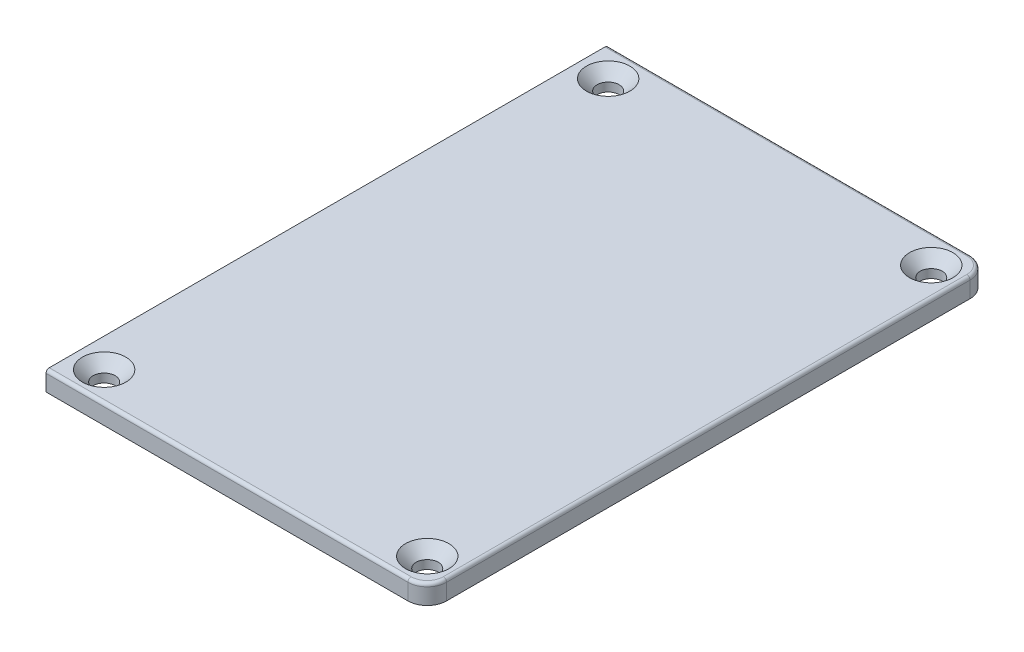
ISO-10303-21;
HEADER;
FILE_DESCRIPTION(('STEP AP214'),'2;1');
FILE_NAME('part.step','',(''),(''),'','','');
FILE_SCHEMA(('AUTOMOTIVE_DESIGN { 1 0 10303 214 1 1 1 1 }'));
ENDSEC;
DATA;
#1=APPLICATION_CONTEXT('core data for automotive mechanical design processes');
#2=APPLICATION_PROTOCOL_DEFINITION('international standard','automotive_design',2000,#1);
#3=PRODUCT_CONTEXT('',#1,'mechanical');
#4=PRODUCT('Part','Part','',(#3));
#5=PRODUCT_RELATED_PRODUCT_CATEGORY('part','',(#4));
#6=PRODUCT_DEFINITION_FORMATION('','',#4);
#7=PRODUCT_DEFINITION_CONTEXT('part definition',#1,'design');
#8=PRODUCT_DEFINITION('design','',#6,#7);
#9=PRODUCT_DEFINITION_SHAPE('','',#8);
#10=(LENGTH_UNIT() NAMED_UNIT(*) SI_UNIT(.MILLI.,.METRE.));
#11=(NAMED_UNIT(*) PLANE_ANGLE_UNIT() SI_UNIT($,.RADIAN.));
#12=(NAMED_UNIT(*) SI_UNIT($,.STERADIAN.) SOLID_ANGLE_UNIT());
#13=UNCERTAINTY_MEASURE_WITH_UNIT(LENGTH_MEASURE(1.E-05),#10,'distance_accuracy_value','');
#14=(GEOMETRIC_REPRESENTATION_CONTEXT(3) GLOBAL_UNCERTAINTY_ASSIGNED_CONTEXT((#13)) GLOBAL_UNIT_ASSIGNED_CONTEXT((#10,
#11,#12)) REPRESENTATION_CONTEXT('',''));
#15=CARTESIAN_POINT('',(0.,0.,0.));
#16=DIRECTION('',(0.,0.,1.));
#17=DIRECTION('',(1.,0.,0.));
#18=AXIS2_PLACEMENT_3D('',#15,#16,#17);
#19=CARTESIAN_POINT('',(29.5,1.5,43.5));
#20=DIRECTION('',(-1.,0.,0.));
#21=DIRECTION('',(0.,0.,1.));
#22=AXIS2_PLACEMENT_3D('',#19,#20,#21);
#23=PLANE('',#22);
#24=DIRECTION('',(0.,-1.,0.));
#25=VECTOR('',#24,1.);
#26=CARTESIAN_POINT('',(29.5,1.5,-40.5));
#27=LINE('',#26,#25);
#28=CARTESIAN_POINT('',(29.5,-1.5,-40.5));
#29=VERTEX_POINT('',#28);
#30=CARTESIAN_POINT('',(29.5,1.,-40.5));
#31=VERTEX_POINT('',#30);
#32=EDGE_CURVE('E157',#29,#31,#27,.F.);
#33=ORIENTED_EDGE('',*,*,#32,.T.);
#34=DIRECTION('',(0.,0.,-1.));
#35=VECTOR('',#34,1.);
#36=CARTESIAN_POINT('',(29.5,1.,43.5));
#37=LINE('',#36,#35);
#38=CARTESIAN_POINT('',(29.5,1.,40.5));
#39=VERTEX_POINT('',#38);
#40=EDGE_CURVE('E11',#31,#39,#37,.F.);
#41=ORIENTED_EDGE('',*,*,#40,.T.);
#42=DIRECTION('',(0.,-1.,0.));
#43=VECTOR('',#42,1.);
#44=CARTESIAN_POINT('',(29.5,1.5,40.5));
#45=LINE('',#44,#43);
#46=CARTESIAN_POINT('',(29.5,-1.5,40.5));
#47=VERTEX_POINT('',#46);
#48=EDGE_CURVE('E154',#39,#47,#45,.T.);
#49=ORIENTED_EDGE('',*,*,#48,.T.);
#50=DIRECTION('',(0.,0.,-1.));
#51=VECTOR('',#50,1.);
#52=CARTESIAN_POINT('',(29.5,-1.5,43.5));
#53=LINE('',#52,#51);
#54=EDGE_CURVE('E132',#47,#29,#53,.T.);
#55=ORIENTED_EDGE('',*,*,#54,.T.);
#56=EDGE_LOOP('',(#33,#41,#49,#55));
#57=FACE_BOUND('',#56,.T.);
#58=ADVANCED_FACE('F39',(#57),#23,.F.);
#59=CARTESIAN_POINT('',(-29.5,1.5,-43.5));
#60=DIRECTION('',(0.,0.,1.));
#61=DIRECTION('',(1.,0.,0.));
#62=AXIS2_PLACEMENT_3D('',#59,#60,#61);
#63=PLANE('',#62);
#64=DIRECTION('',(0.,-1.,0.));
#65=VECTOR('',#64,1.);
#66=CARTESIAN_POINT('',(-29.5,1.5,-43.5));
#67=LINE('',#66,#65);
#68=CARTESIAN_POINT('',(-29.5,1.,-43.5));
#69=VERTEX_POINT('',#68);
#70=CARTESIAN_POINT('',(-29.5,-1.5,-43.5));
#71=VERTEX_POINT('',#70);
#72=EDGE_CURVE('E112',#69,#71,#67,.T.);
#73=ORIENTED_EDGE('',*,*,#72,.F.);
#74=DIRECTION('',(-1.,0.,0.));
#75=VECTOR('',#74,1.);
#76=CARTESIAN_POINT('',(-29.5,1.,-43.5));
#77=LINE('',#76,#75);
#78=CARTESIAN_POINT('',(26.5,1.,-43.5));
#79=VERTEX_POINT('',#78);
#80=EDGE_CURVE('E64',#69,#79,#77,.F.);
#81=ORIENTED_EDGE('',*,*,#80,.T.);
#82=DIRECTION('',(0.,-1.,0.));
#83=VECTOR('',#82,1.);
#84=CARTESIAN_POINT('',(26.5,1.5,-43.5));
#85=LINE('',#84,#83);
#86=CARTESIAN_POINT('',(26.5,-1.5,-43.5));
#87=VERTEX_POINT('',#86);
#88=EDGE_CURVE('E123',#79,#87,#85,.T.);
#89=ORIENTED_EDGE('',*,*,#88,.T.);
#90=DIRECTION('',(-1.,0.,0.));
#91=VECTOR('',#90,1.);
#92=CARTESIAN_POINT('',(-29.5,-1.5,-43.5));
#93=LINE('',#92,#91);
#94=EDGE_CURVE('E127',#87,#71,#93,.T.);
#95=ORIENTED_EDGE('',*,*,#94,.T.);
#96=EDGE_LOOP('',(#73,#81,#89,#95));
#97=FACE_BOUND('',#96,.T.);
#98=ADVANCED_FACE('F128',(#97),#63,.F.);
#99=CARTESIAN_POINT('',(-29.5,1.5,43.5));
#100=DIRECTION('',(1.,0.,0.));
#101=DIRECTION('',(0.,0.,-1.));
#102=AXIS2_PLACEMENT_3D('',#99,#100,#101);
#103=PLANE('',#102);
#104=DIRECTION('',(0.,-1.,0.));
#105=VECTOR('',#104,1.);
#106=CARTESIAN_POINT('',(-29.5,1.5,43.5));
#107=LINE('',#106,#105);
#108=CARTESIAN_POINT('',(-29.5,1.,43.5));
#109=VERTEX_POINT('',#108);
#110=CARTESIAN_POINT('',(-29.5,-1.5,43.5));
#111=VERTEX_POINT('',#110);
#112=EDGE_CURVE('E124',#109,#111,#107,.T.);
#113=ORIENTED_EDGE('',*,*,#112,.F.);
#114=CARTESIAN_POINT('',(-29.5,1.,43.));
#115=DIRECTION('',(1.,0.,0.));
#116=DIRECTION('',(0.,0.,-1.));
#117=AXIS2_PLACEMENT_3D('',#114,#115,#116);
#118=CIRCLE('',#117,0.5);
#119=CARTESIAN_POINT('',(-29.5,1.5,43.));
#120=VERTEX_POINT('',#119);
#121=EDGE_CURVE('E185',#109,#120,#118,.F.);
#122=ORIENTED_EDGE('',*,*,#121,.T.);
#123=DIRECTION('',(0.,0.,1.));
#124=VECTOR('',#123,1.);
#125=CARTESIAN_POINT('',(-29.5,1.5,43.5));
#126=LINE('',#125,#124);
#127=CARTESIAN_POINT('',(-29.5,1.5,-43.));
#128=VERTEX_POINT('',#127);
#129=EDGE_CURVE('E140',#128,#120,#126,.T.);
#130=ORIENTED_EDGE('',*,*,#129,.F.);
#131=CARTESIAN_POINT('',(-29.5,1.,-43.));
#132=DIRECTION('',(1.,0.,0.));
#133=DIRECTION('',(0.,0.,-1.));
#134=AXIS2_PLACEMENT_3D('',#131,#132,#133);
#135=CIRCLE('',#134,0.5);
#136=EDGE_CURVE('E121',#128,#69,#135,.F.);
#137=ORIENTED_EDGE('',*,*,#136,.T.);
#138=ORIENTED_EDGE('',*,*,#72,.T.);
#139=DIRECTION('',(0.,0.,1.));
#140=VECTOR('',#139,1.);
#141=CARTESIAN_POINT('',(-29.5,-1.5,43.5));
#142=LINE('',#141,#140);
#143=EDGE_CURVE('E117',#71,#111,#142,.T.);
#144=ORIENTED_EDGE('',*,*,#143,.T.);
#145=EDGE_LOOP('',(#113,#122,#130,#137,#138,#144));
#146=FACE_BOUND('',#145,.T.);
#147=ADVANCED_FACE('F115',(#146),#103,.F.);
#148=CARTESIAN_POINT('',(-29.5,1.5,43.5));
#149=DIRECTION('',(0.,0.,-1.));
#150=DIRECTION('',(-1.,0.,0.));
#151=AXIS2_PLACEMENT_3D('',#148,#149,#150);
#152=PLANE('',#151);
#153=DIRECTION('',(0.,-1.,0.));
#154=VECTOR('',#153,1.);
#155=CARTESIAN_POINT('',(26.5,1.5,43.5));
#156=LINE('',#155,#154);
#157=CARTESIAN_POINT('',(26.5,-1.5,43.5));
#158=VERTEX_POINT('',#157);
#159=CARTESIAN_POINT('',(26.5,1.,43.5));
#160=VERTEX_POINT('',#159);
#161=EDGE_CURVE('E160',#158,#160,#156,.F.);
#162=ORIENTED_EDGE('',*,*,#161,.T.);
#163=DIRECTION('',(1.,0.,0.));
#164=VECTOR('',#163,1.);
#165=CARTESIAN_POINT('',(-29.5,1.,43.5));
#166=LINE('',#165,#164);
#167=EDGE_CURVE('E180',#160,#109,#166,.F.);
#168=ORIENTED_EDGE('',*,*,#167,.T.);
#169=ORIENTED_EDGE('',*,*,#112,.T.);
#170=DIRECTION('',(1.,0.,0.));
#171=VECTOR('',#170,1.);
#172=CARTESIAN_POINT('',(-29.5,-1.5,43.5));
#173=LINE('',#172,#171);
#174=EDGE_CURVE('E136',#111,#158,#173,.T.);
#175=ORIENTED_EDGE('',*,*,#174,.T.);
#176=EDGE_LOOP('',(#162,#168,#169,#175));
#177=FACE_BOUND('',#176,.T.);
#178=ADVANCED_FACE('F283',(#177),#152,.F.);
#179=CARTESIAN_POINT('',(0.,1.5,0.));
#180=DIRECTION('',(0.,-1.,0.));
#181=DIRECTION('',(0.,0.,-1.));
#182=AXIS2_PLACEMENT_3D('',#179,#180,#181);
#183=PLANE('',#182);
#184=ORIENTED_EDGE('',*,*,#129,.T.);
#185=DIRECTION('',(1.,0.,0.));
#186=VECTOR('',#185,1.);
#187=CARTESIAN_POINT('',(0.,1.5,43.));
#188=LINE('',#187,#186);
#189=CARTESIAN_POINT('',(26.5,1.5,43.));
#190=VERTEX_POINT('',#189);
#191=EDGE_CURVE('E176',#120,#190,#188,.T.);
#192=ORIENTED_EDGE('',*,*,#191,.T.);
#193=CARTESIAN_POINT('',(26.5,1.5,40.5));
#194=DIRECTION('',(0.,-1.,0.));
#195=DIRECTION('',(0.,0.,-1.));
#196=AXIS2_PLACEMENT_3D('',#193,#194,#195);
#197=CIRCLE('',#196,2.5);
#198=CARTESIAN_POINT('',(29.,1.5,40.5));
#199=VERTEX_POINT('',#198);
#200=EDGE_CURVE('E173',#190,#199,#197,.F.);
#201=ORIENTED_EDGE('',*,*,#200,.T.);
#202=DIRECTION('',(0.,0.,-1.));
#203=VECTOR('',#202,1.);
#204=CARTESIAN_POINT('',(29.,1.5,0.));
#205=LINE('',#204,#203);
#206=CARTESIAN_POINT('',(29.,1.5,-40.5));
#207=VERTEX_POINT('',#206);
#208=EDGE_CURVE('E164',#199,#207,#205,.T.);
#209=ORIENTED_EDGE('',*,*,#208,.T.);
#210=CARTESIAN_POINT('',(26.5,1.5,-40.5));
#211=DIRECTION('',(0.,-1.,0.));
#212=DIRECTION('',(0.,0.,-1.));
#213=AXIS2_PLACEMENT_3D('',#210,#211,#212);
#214=CIRCLE('',#213,2.5);
#215=CARTESIAN_POINT('',(26.5,1.5,-43.));
#216=VERTEX_POINT('',#215);
#217=EDGE_CURVE('E167',#207,#216,#214,.F.);
#218=ORIENTED_EDGE('',*,*,#217,.T.);
#219=DIRECTION('',(-1.,0.,0.));
#220=VECTOR('',#219,1.);
#221=CARTESIAN_POINT('',(0.,1.5,-43.));
#222=LINE('',#221,#220);
#223=EDGE_CURVE('E170',#216,#128,#222,.T.);
#224=ORIENTED_EDGE('',*,*,#223,.T.);
#225=EDGE_LOOP('',(#184,#192,#201,#209,#218,#224));
#226=FACE_BOUND('',#225,.T.);
#227=CARTESIAN_POINT('',(-25.,1.5,-39.));
#228=DIRECTION('',(0.,1.,0.));
#229=DIRECTION('',(0.,0.,1.));
#230=AXIS2_PLACEMENT_3D('',#227,#228,#229);
#231=CIRCLE('',#230,3.36);
#232=CARTESIAN_POINT('',(-25.,1.5,-35.64));
#233=VERTEX_POINT('',#232);
#234=EDGE_CURVE('E210',#233,#233,#231,.T.);
#235=ORIENTED_EDGE('',*,*,#234,.F.);
#236=EDGE_LOOP('',(#235));
#237=FACE_BOUND('',#236,.T.);
#238=CARTESIAN_POINT('',(-25.,1.5,39.));
#239=DIRECTION('',(0.,1.,0.));
#240=DIRECTION('',(0.,0.,1.));
#241=AXIS2_PLACEMENT_3D('',#238,#239,#240);
#242=CIRCLE('',#241,3.36);
#243=CARTESIAN_POINT('',(-25.,1.5,42.36));
#244=VERTEX_POINT('',#243);
#245=EDGE_CURVE('E228',#244,#244,#242,.T.);
#246=ORIENTED_EDGE('',*,*,#245,.F.);
#247=EDGE_LOOP('',(#246));
#248=FACE_BOUND('',#247,.T.);
#249=CARTESIAN_POINT('',(25.,1.5,39.));
#250=DIRECTION('',(0.,1.,0.));
#251=DIRECTION('',(0.,0.,1.));
#252=AXIS2_PLACEMENT_3D('',#249,#250,#251);
#253=CIRCLE('',#252,3.36);
#254=CARTESIAN_POINT('',(25.,1.5,42.36));
#255=VERTEX_POINT('',#254);
#256=EDGE_CURVE('E240',#255,#255,#253,.T.);
#257=ORIENTED_EDGE('',*,*,#256,.F.);
#258=EDGE_LOOP('',(#257));
#259=FACE_BOUND('',#258,.T.);
#260=CARTESIAN_POINT('',(25.,1.5,-39.));
#261=DIRECTION('',(0.,1.,0.));
#262=DIRECTION('',(0.,0.,1.));
#263=AXIS2_PLACEMENT_3D('',#260,#261,#262);
#264=CIRCLE('',#263,3.36);
#265=CARTESIAN_POINT('',(25.,1.5,-35.64));
#266=VERTEX_POINT('',#265);
#267=EDGE_CURVE('E252',#266,#266,#264,.T.);
#268=ORIENTED_EDGE('',*,*,#267,.F.);
#269=EDGE_LOOP('',(#268));
#270=FACE_BOUND('',#269,.T.);
#271=ADVANCED_FACE('F292',(#226,#237,#248,#259,#270),#183,.F.);
#272=CARTESIAN_POINT('',(0.,-1.5,0.));
#273=DIRECTION('',(0.,-1.,0.));
#274=DIRECTION('',(0.,0.,-1.));
#275=AXIS2_PLACEMENT_3D('',#272,#273,#274);
#276=PLANE('',#275);
#277=CARTESIAN_POINT('',(-25.,-1.5,-39.));
#278=DIRECTION('',(0.,1.,0.));
#279=DIRECTION('',(0.,0.,1.));
#280=AXIS2_PLACEMENT_3D('',#277,#278,#279);
#281=CIRCLE('',#280,1.7);
#282=CARTESIAN_POINT('',(-25.,-1.5,-37.3));
#283=VERTEX_POINT('',#282);
#284=EDGE_CURVE('E222',#283,#283,#281,.T.);
#285=ORIENTED_EDGE('',*,*,#284,.T.);
#286=EDGE_LOOP('',(#285));
#287=FACE_BOUND('',#286,.T.);
#288=CARTESIAN_POINT('',(-25.,-1.5,39.));
#289=DIRECTION('',(0.,1.,0.));
#290=DIRECTION('',(0.,0.,1.));
#291=AXIS2_PLACEMENT_3D('',#288,#289,#290);
#292=CIRCLE('',#291,1.7);
#293=CARTESIAN_POINT('',(-25.,-1.5,40.7));
#294=VERTEX_POINT('',#293);
#295=EDGE_CURVE('E236',#294,#294,#292,.T.);
#296=ORIENTED_EDGE('',*,*,#295,.T.);
#297=EDGE_LOOP('',(#296));
#298=FACE_BOUND('',#297,.T.);
#299=CARTESIAN_POINT('',(25.,-1.5,39.));
#300=DIRECTION('',(0.,1.,0.));
#301=DIRECTION('',(0.,0.,1.));
#302=AXIS2_PLACEMENT_3D('',#299,#300,#301);
#303=CIRCLE('',#302,1.7);
#304=CARTESIAN_POINT('',(25.,-1.5,40.7));
#305=VERTEX_POINT('',#304);
#306=EDGE_CURVE('E248',#305,#305,#303,.T.);
#307=ORIENTED_EDGE('',*,*,#306,.T.);
#308=EDGE_LOOP('',(#307));
#309=FACE_BOUND('',#308,.T.);
#310=CARTESIAN_POINT('',(25.,-1.5,-39.));
#311=DIRECTION('',(0.,1.,0.));
#312=DIRECTION('',(0.,0.,1.));
#313=AXIS2_PLACEMENT_3D('',#310,#311,#312);
#314=CIRCLE('',#313,1.7);
#315=CARTESIAN_POINT('',(25.,-1.5,-37.3));
#316=VERTEX_POINT('',#315);
#317=EDGE_CURVE('E260',#316,#316,#314,.T.);
#318=ORIENTED_EDGE('',*,*,#317,.T.);
#319=EDGE_LOOP('',(#318));
#320=FACE_BOUND('',#319,.T.);
#321=ORIENTED_EDGE('',*,*,#94,.F.);
#322=CARTESIAN_POINT('',(26.5,-1.5,-40.5));
#323=DIRECTION('',(0.,-1.,0.));
#324=DIRECTION('',(0.,0.,-1.));
#325=AXIS2_PLACEMENT_3D('',#322,#323,#324);
#326=CIRCLE('',#325,3.);
#327=EDGE_CURVE('E151',#87,#29,#326,.T.);
#328=ORIENTED_EDGE('',*,*,#327,.T.);
#329=ORIENTED_EDGE('',*,*,#54,.F.);
#330=CARTESIAN_POINT('',(26.5,-1.5,40.5));
#331=DIRECTION('',(0.,-1.,0.));
#332=DIRECTION('',(0.,0.,-1.));
#333=AXIS2_PLACEMENT_3D('',#330,#331,#332);
#334=CIRCLE('',#333,3.);
#335=EDGE_CURVE('E148',#47,#158,#334,.T.);
#336=ORIENTED_EDGE('',*,*,#335,.T.);
#337=ORIENTED_EDGE('',*,*,#174,.F.);
#338=ORIENTED_EDGE('',*,*,#143,.F.);
#339=EDGE_LOOP('',(#321,#328,#329,#336,#337,#338));
#340=FACE_BOUND('',#339,.T.);
#341=ADVANCED_FACE('F134',(#287,#298,#309,#320,#340),#276,.T.);
#342=CARTESIAN_POINT('',(25.,1.5,-39.));
#343=DIRECTION('',(0.,1.,0.));
#344=DIRECTION('',(0.,0.,1.));
#345=AXIS2_PLACEMENT_3D('',#342,#343,#344);
#346=CYLINDRICAL_SURFACE('',#345,1.69999999999999);
#347=ORIENTED_EDGE('',*,*,#317,.F.);
#348=EDGE_LOOP('',(#347));
#349=FACE_BOUND('',#348,.T.);
#350=CARTESIAN_POINT('',(25.,-0.160000000000023,-39.));
#351=DIRECTION('',(0.,1.,0.));
#352=DIRECTION('',(0.,0.,1.));
#353=AXIS2_PLACEMENT_3D('',#350,#351,#352);
#354=CIRCLE('',#353,1.69999999999999);
#355=CARTESIAN_POINT('',(25.,-0.160000000000023,-37.3));
#356=VERTEX_POINT('',#355);
#357=EDGE_CURVE('E256',#356,#356,#354,.T.);
#358=ORIENTED_EDGE('',*,*,#357,.T.);
#359=EDGE_LOOP('',(#358));
#360=FACE_BOUND('',#359,.T.);
#361=ADVANCED_FACE('F419',(#349,#360),#346,.F.);
#362=CARTESIAN_POINT('',(25.,1.5,-39.));
#363=DIRECTION('',(0.,1.,0.));
#364=DIRECTION('',(0.,0.,1.));
#365=AXIS2_PLACEMENT_3D('',#362,#363,#364);
#366=CONICAL_SURFACE('',#365,3.36,0.785398163397446);
#367=ORIENTED_EDGE('',*,*,#357,.F.);
#368=EDGE_LOOP('',(#367));
#369=FACE_BOUND('',#368,.T.);
#370=ORIENTED_EDGE('',*,*,#267,.T.);
#371=EDGE_LOOP('',(#370));
#372=FACE_BOUND('',#371,.T.);
#373=ADVANCED_FACE('F410',(#369,#372),#366,.F.);
#374=CARTESIAN_POINT('',(25.,1.5,39.));
#375=DIRECTION('',(0.,1.,0.));
#376=DIRECTION('',(0.,0.,1.));
#377=AXIS2_PLACEMENT_3D('',#374,#375,#376);
#378=CYLINDRICAL_SURFACE('',#377,1.69999999999999);
#379=ORIENTED_EDGE('',*,*,#306,.F.);
#380=EDGE_LOOP('',(#379));
#381=FACE_BOUND('',#380,.T.);
#382=CARTESIAN_POINT('',(25.,-0.160000000000023,39.));
#383=DIRECTION('',(0.,1.,0.));
#384=DIRECTION('',(0.,0.,1.));
#385=AXIS2_PLACEMENT_3D('',#382,#383,#384);
#386=CIRCLE('',#385,1.69999999999999);
#387=CARTESIAN_POINT('',(25.,-0.160000000000023,40.7));
#388=VERTEX_POINT('',#387);
#389=EDGE_CURVE('E244',#388,#388,#386,.T.);
#390=ORIENTED_EDGE('',*,*,#389,.T.);
#391=EDGE_LOOP('',(#390));
#392=FACE_BOUND('',#391,.T.);
#393=ADVANCED_FACE('F401',(#381,#392),#378,.F.);
#394=CARTESIAN_POINT('',(25.,1.5,39.));
#395=DIRECTION('',(0.,1.,0.));
#396=DIRECTION('',(0.,0.,1.));
#397=AXIS2_PLACEMENT_3D('',#394,#395,#396);
#398=CONICAL_SURFACE('',#397,3.36,0.785398163397446);
#399=ORIENTED_EDGE('',*,*,#389,.F.);
#400=EDGE_LOOP('',(#399));
#401=FACE_BOUND('',#400,.T.);
#402=ORIENTED_EDGE('',*,*,#256,.T.);
#403=EDGE_LOOP('',(#402));
#404=FACE_BOUND('',#403,.T.);
#405=ADVANCED_FACE('F392',(#401,#404),#398,.F.);
#406=CARTESIAN_POINT('',(-25.,1.5,39.));
#407=DIRECTION('',(0.,1.,0.));
#408=DIRECTION('',(0.,0.,1.));
#409=AXIS2_PLACEMENT_3D('',#406,#407,#408);
#410=CYLINDRICAL_SURFACE('',#409,1.69999999999999);
#411=ORIENTED_EDGE('',*,*,#295,.F.);
#412=EDGE_LOOP('',(#411));
#413=FACE_BOUND('',#412,.T.);
#414=CARTESIAN_POINT('',(-25.,-0.160000000000023,39.));
#415=DIRECTION('',(0.,1.,0.));
#416=DIRECTION('',(0.,0.,1.));
#417=AXIS2_PLACEMENT_3D('',#414,#415,#416);
#418=CIRCLE('',#417,1.69999999999999);
#419=CARTESIAN_POINT('',(-25.,-0.160000000000023,40.7));
#420=VERTEX_POINT('',#419);
#421=EDGE_CURVE('E232',#420,#420,#418,.T.);
#422=ORIENTED_EDGE('',*,*,#421,.T.);
#423=EDGE_LOOP('',(#422));
#424=FACE_BOUND('',#423,.T.);
#425=ADVANCED_FACE('F383',(#413,#424),#410,.F.);
#426=CARTESIAN_POINT('',(-25.,1.5,39.));
#427=DIRECTION('',(0.,1.,0.));
#428=DIRECTION('',(0.,0.,1.));
#429=AXIS2_PLACEMENT_3D('',#426,#427,#428);
#430=CONICAL_SURFACE('',#429,3.36,0.785398163397444);
#431=ORIENTED_EDGE('',*,*,#421,.F.);
#432=EDGE_LOOP('',(#431));
#433=FACE_BOUND('',#432,.T.);
#434=ORIENTED_EDGE('',*,*,#245,.T.);
#435=EDGE_LOOP('',(#434));
#436=FACE_BOUND('',#435,.T.);
#437=ADVANCED_FACE('F374',(#433,#436),#430,.F.);
#438=CARTESIAN_POINT('',(-25.,1.5,-39.));
#439=DIRECTION('',(0.,1.,0.));
#440=DIRECTION('',(0.,0.,1.));
#441=AXIS2_PLACEMENT_3D('',#438,#439,#440);
#442=CYLINDRICAL_SURFACE('',#441,1.69999999999999);
#443=ORIENTED_EDGE('',*,*,#284,.F.);
#444=EDGE_LOOP('',(#443));
#445=FACE_BOUND('',#444,.T.);
#446=CARTESIAN_POINT('',(-25.,-0.160000000000023,-39.));
#447=DIRECTION('',(0.,1.,0.));
#448=DIRECTION('',(0.,0.,1.));
#449=AXIS2_PLACEMENT_3D('',#446,#447,#448);
#450=CIRCLE('',#449,1.69999999999999);
#451=CARTESIAN_POINT('',(-25.,-0.160000000000023,-37.3));
#452=VERTEX_POINT('',#451);
#453=EDGE_CURVE('E216',#452,#452,#450,.T.);
#454=ORIENTED_EDGE('',*,*,#453,.T.);
#455=EDGE_LOOP('',(#454));
#456=FACE_BOUND('',#455,.T.);
#457=ADVANCED_FACE('F364',(#445,#456),#442,.F.);
#458=CARTESIAN_POINT('',(-25.,1.5,-39.));
#459=DIRECTION('',(0.,1.,0.));
#460=DIRECTION('',(0.,0.,1.));
#461=AXIS2_PLACEMENT_3D('',#458,#459,#460);
#462=CONICAL_SURFACE('',#461,3.36,0.785398163397444);
#463=ORIENTED_EDGE('',*,*,#453,.F.);
#464=EDGE_LOOP('',(#463));
#465=FACE_BOUND('',#464,.T.);
#466=ORIENTED_EDGE('',*,*,#234,.T.);
#467=EDGE_LOOP('',(#466));
#468=FACE_BOUND('',#467,.T.);
#469=ADVANCED_FACE('F314',(#465,#468),#462,.F.);
#470=CARTESIAN_POINT('',(26.5,1.5,-40.5));
#471=DIRECTION('',(0.,-1.,0.));
#472=DIRECTION('',(0.,0.,-1.));
#473=AXIS2_PLACEMENT_3D('',#470,#471,#472);
#474=CYLINDRICAL_SURFACE('',#473,3.);
#475=ORIENTED_EDGE('',*,*,#88,.F.);
#476=CARTESIAN_POINT('',(26.5,1.,-40.5));
#477=DIRECTION('',(0.,-1.,0.));
#478=DIRECTION('',(0.,0.,-1.));
#479=AXIS2_PLACEMENT_3D('',#476,#477,#478);
#480=CIRCLE('',#479,3.);
#481=EDGE_CURVE('E49',#79,#31,#480,.T.);
#482=ORIENTED_EDGE('',*,*,#481,.T.);
#483=ORIENTED_EDGE('',*,*,#32,.F.);
#484=ORIENTED_EDGE('',*,*,#327,.F.);
#485=EDGE_LOOP('',(#475,#482,#483,#484));
#486=FACE_BOUND('',#485,.T.);
#487=ADVANCED_FACE('F272',(#486),#474,.T.);
#488=CARTESIAN_POINT('',(26.5,1.5,40.5));
#489=DIRECTION('',(0.,-1.,0.));
#490=DIRECTION('',(0.,0.,-1.));
#491=AXIS2_PLACEMENT_3D('',#488,#489,#490);
#492=CYLINDRICAL_SURFACE('',#491,3.);
#493=ORIENTED_EDGE('',*,*,#48,.F.);
#494=CARTESIAN_POINT('',(26.5,1.,40.5));
#495=DIRECTION('',(0.,-1.,0.));
#496=DIRECTION('',(0.,0.,-1.));
#497=AXIS2_PLACEMENT_3D('',#494,#495,#496);
#498=CIRCLE('',#497,3.);
#499=EDGE_CURVE('E188',#39,#160,#498,.T.);
#500=ORIENTED_EDGE('',*,*,#499,.T.);
#501=ORIENTED_EDGE('',*,*,#161,.F.);
#502=ORIENTED_EDGE('',*,*,#335,.F.);
#503=EDGE_LOOP('',(#493,#500,#501,#502));
#504=FACE_BOUND('',#503,.T.);
#505=ADVANCED_FACE('F280',(#504),#492,.T.);
#506=CARTESIAN_POINT('',(0.,1.,-43.));
#507=DIRECTION('',(-1.,0.,0.));
#508=DIRECTION('',(0.,0.,1.));
#509=AXIS2_PLACEMENT_3D('',#506,#507,#508);
#510=CYLINDRICAL_SURFACE('',#509,0.5);
#511=ORIENTED_EDGE('',*,*,#136,.F.);
#512=ORIENTED_EDGE('',*,*,#223,.F.);
#513=CARTESIAN_POINT('',(26.5,1.,-43.));
#514=DIRECTION('',(1.,0.,0.));
#515=DIRECTION('',(0.,0.,-1.));
#516=AXIS2_PLACEMENT_3D('',#513,#514,#515);
#517=CIRCLE('',#516,0.5);
#518=EDGE_CURVE('E43',#79,#216,#517,.T.);
#519=ORIENTED_EDGE('',*,*,#518,.F.);
#520=ORIENTED_EDGE('',*,*,#80,.F.);
#521=EDGE_LOOP('',(#511,#512,#519,#520));
#522=FACE_BOUND('',#521,.T.);
#523=ADVANCED_FACE('F41',(#522),#510,.T.);
#524=CARTESIAN_POINT('',(26.5,1.,-40.5));
#525=DIRECTION('',(0.,-1.,0.));
#526=DIRECTION('',(0.,0.,-1.));
#527=AXIS2_PLACEMENT_3D('',#524,#525,#526);
#528=TOROIDAL_SURFACE('',#527,2.5,0.5);
#529=ORIENTED_EDGE('',*,*,#518,.T.);
#530=ORIENTED_EDGE('',*,*,#217,.F.);
#531=CARTESIAN_POINT('',(29.,1.,-40.5));
#532=DIRECTION('',(0.,0.,1.));
#533=DIRECTION('',(1.,0.,0.));
#534=AXIS2_PLACEMENT_3D('',#531,#532,#533);
#535=CIRCLE('',#534,0.5);
#536=EDGE_CURVE('E201',#31,#207,#535,.T.);
#537=ORIENTED_EDGE('',*,*,#536,.F.);
#538=ORIENTED_EDGE('',*,*,#481,.F.);
#539=EDGE_LOOP('',(#529,#530,#537,#538));
#540=FACE_BOUND('',#539,.T.);
#541=ADVANCED_FACE('F275',(#540),#528,.T.);
#542=CARTESIAN_POINT('',(29.,1.,0.));
#543=DIRECTION('',(0.,0.,-1.));
#544=DIRECTION('',(-1.,0.,0.));
#545=AXIS2_PLACEMENT_3D('',#542,#543,#544);
#546=CYLINDRICAL_SURFACE('',#545,0.5);
#547=ORIENTED_EDGE('',*,*,#536,.T.);
#548=ORIENTED_EDGE('',*,*,#208,.F.);
#549=CARTESIAN_POINT('',(29.,1.,40.5));
#550=DIRECTION('',(0.,0.,1.));
#551=DIRECTION('',(1.,0.,0.));
#552=AXIS2_PLACEMENT_3D('',#549,#550,#551);
#553=CIRCLE('',#552,0.5);
#554=EDGE_CURVE('E198',#39,#199,#553,.T.);
#555=ORIENTED_EDGE('',*,*,#554,.F.);
#556=ORIENTED_EDGE('',*,*,#40,.F.);
#557=EDGE_LOOP('',(#547,#548,#555,#556));
#558=FACE_BOUND('',#557,.T.);
#559=ADVANCED_FACE('F277',(#558),#546,.T.);
#560=CARTESIAN_POINT('',(26.5,1.,40.5));
#561=DIRECTION('',(0.,-1.,0.));
#562=DIRECTION('',(0.,0.,-1.));
#563=AXIS2_PLACEMENT_3D('',#560,#561,#562);
#564=TOROIDAL_SURFACE('',#563,2.5,0.5);
#565=ORIENTED_EDGE('',*,*,#554,.T.);
#566=ORIENTED_EDGE('',*,*,#200,.F.);
#567=CARTESIAN_POINT('',(26.5,1.,43.));
#568=DIRECTION('',(-1.,0.,0.));
#569=DIRECTION('',(0.,0.,1.));
#570=AXIS2_PLACEMENT_3D('',#567,#568,#569);
#571=CIRCLE('',#570,0.5);
#572=EDGE_CURVE('E195',#160,#190,#571,.T.);
#573=ORIENTED_EDGE('',*,*,#572,.F.);
#574=ORIENTED_EDGE('',*,*,#499,.F.);
#575=EDGE_LOOP('',(#565,#566,#573,#574));
#576=FACE_BOUND('',#575,.T.);
#577=ADVANCED_FACE('F295',(#576),#564,.T.);
#578=CARTESIAN_POINT('',(0.,1.,43.));
#579=DIRECTION('',(1.,0.,0.));
#580=DIRECTION('',(0.,0.,-1.));
#581=AXIS2_PLACEMENT_3D('',#578,#579,#580);
#582=CYLINDRICAL_SURFACE('',#581,0.5);
#583=ORIENTED_EDGE('',*,*,#121,.F.);
#584=ORIENTED_EDGE('',*,*,#167,.F.);
#585=ORIENTED_EDGE('',*,*,#572,.T.);
#586=ORIENTED_EDGE('',*,*,#191,.F.);
#587=EDGE_LOOP('',(#583,#584,#585,#586));
#588=FACE_BOUND('',#587,.T.);
#589=ADVANCED_FACE('F288',(#588),#582,.T.);
#590=CLOSED_SHELL('',(#58,#98,#147,#178,#271,#341,#361,#373,#393,#405,#425,#437,#457,#469,#487,
#505,#523,#541,#559,#577,#589));
#591=MANIFOLD_SOLID_BREP('B2',#590);
#592=ADVANCED_BREP_SHAPE_REPRESENTATION('',(#18,#591),#14);
#593=SHAPE_DEFINITION_REPRESENTATION(#9,#592);
ENDSEC;
END-ISO-10303-21;
